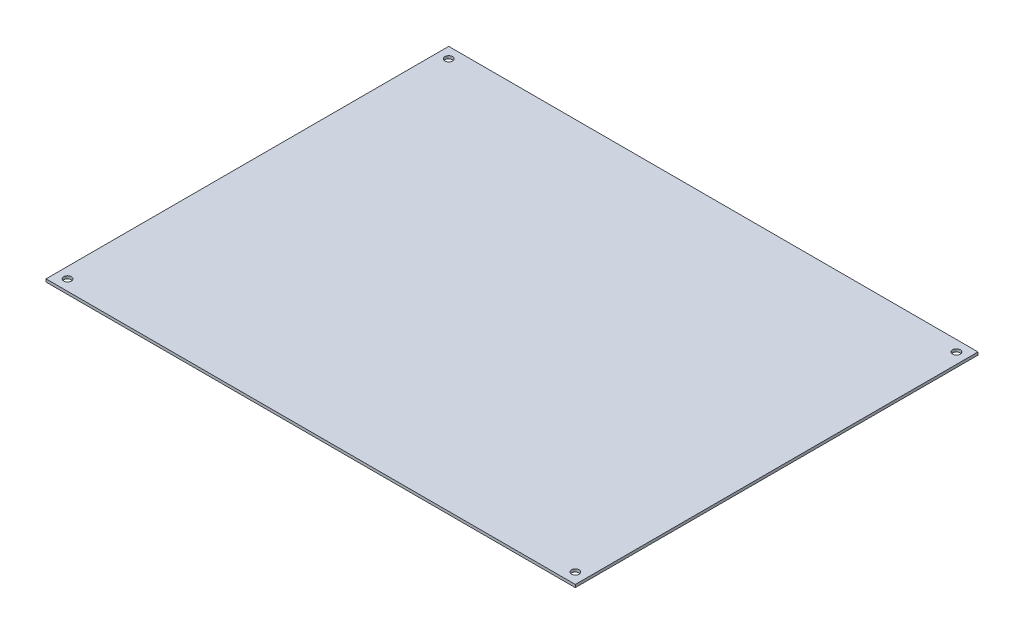
ISO-10303-21;
HEADER;
FILE_DESCRIPTION(('STEP AP214'),'2;1');
FILE_NAME('part.step','',(''),(''),'','','');
FILE_SCHEMA(('AUTOMOTIVE_DESIGN { 1 0 10303 214 1 1 1 1 }'));
ENDSEC;
DATA;
#1=APPLICATION_CONTEXT('core data for automotive mechanical design processes');
#2=APPLICATION_PROTOCOL_DEFINITION('international standard','automotive_design',2000,#1);
#3=PRODUCT_CONTEXT('',#1,'mechanical');
#4=PRODUCT('Part','Part','',(#3));
#5=PRODUCT_RELATED_PRODUCT_CATEGORY('part','',(#4));
#6=PRODUCT_DEFINITION_FORMATION('','',#4);
#7=PRODUCT_DEFINITION_CONTEXT('part definition',#1,'design');
#8=PRODUCT_DEFINITION('design','',#6,#7);
#9=PRODUCT_DEFINITION_SHAPE('','',#8);
#10=(LENGTH_UNIT() NAMED_UNIT(*) SI_UNIT(.MILLI.,.METRE.));
#11=(NAMED_UNIT(*) PLANE_ANGLE_UNIT() SI_UNIT($,.RADIAN.));
#12=(NAMED_UNIT(*) SI_UNIT($,.STERADIAN.) SOLID_ANGLE_UNIT());
#13=UNCERTAINTY_MEASURE_WITH_UNIT(LENGTH_MEASURE(1.E-05),#10,'distance_accuracy_value','');
#14=(GEOMETRIC_REPRESENTATION_CONTEXT(3) GLOBAL_UNCERTAINTY_ASSIGNED_CONTEXT((#13)) GLOBAL_UNIT_ASSIGNED_CONTEXT((#10,
#11,#12)) REPRESENTATION_CONTEXT('',''));
#15=CARTESIAN_POINT('',(0.,0.,0.));
#16=DIRECTION('',(0.,0.,1.));
#17=DIRECTION('',(1.,0.,0.));
#18=AXIS2_PLACEMENT_3D('',#15,#16,#17);
#19=CARTESIAN_POINT('',(-190.25,2.,-144.75));
#20=DIRECTION('',(1.,0.,0.));
#21=DIRECTION('',(0.,0.,-1.));
#22=AXIS2_PLACEMENT_3D('',#19,#20,#21);
#23=PLANE('',#22);
#24=DIRECTION('',(0.,0.,1.));
#25=VECTOR('',#24,1.);
#26=CARTESIAN_POINT('',(-190.25,0.,-144.75));
#27=LINE('',#26,#25);
#28=CARTESIAN_POINT('',(-190.25,0.,-144.75));
#29=VERTEX_POINT('',#28);
#30=CARTESIAN_POINT('',(-190.25,0.,144.75));
#31=VERTEX_POINT('',#30);
#32=EDGE_CURVE('E107',#29,#31,#27,.T.);
#33=ORIENTED_EDGE('',*,*,#32,.T.);
#34=DIRECTION('',(0.,-1.,0.));
#35=VECTOR('',#34,1.);
#36=CARTESIAN_POINT('',(-190.25,2.,144.75));
#37=LINE('',#36,#35);
#38=CARTESIAN_POINT('',(-190.25,2.,144.75));
#39=VERTEX_POINT('',#38);
#40=EDGE_CURVE('E11',#39,#31,#37,.T.);
#41=ORIENTED_EDGE('',*,*,#40,.F.);
#42=DIRECTION('',(0.,0.,1.));
#43=VECTOR('',#42,1.);
#44=CARTESIAN_POINT('',(-190.25,2.,-144.75));
#45=LINE('',#44,#43);
#46=CARTESIAN_POINT('',(-190.25,2.,-144.75));
#47=VERTEX_POINT('',#46);
#48=EDGE_CURVE('E91',#47,#39,#45,.T.);
#49=ORIENTED_EDGE('',*,*,#48,.F.);
#50=DIRECTION('',(0.,-1.,0.));
#51=VECTOR('',#50,1.);
#52=CARTESIAN_POINT('',(-190.25,2.,-144.75));
#53=LINE('',#52,#51);
#54=EDGE_CURVE('E103',#47,#29,#53,.T.);
#55=ORIENTED_EDGE('',*,*,#54,.T.);
#56=EDGE_LOOP('',(#33,#41,#49,#55));
#57=FACE_BOUND('',#56,.T.);
#58=ADVANCED_FACE('F39',(#57),#23,.F.);
#59=CARTESIAN_POINT('',(-190.25,2.,144.75));
#60=DIRECTION('',(0.,0.,-1.));
#61=DIRECTION('',(-1.,0.,0.));
#62=AXIS2_PLACEMENT_3D('',#59,#60,#61);
#63=PLANE('',#62);
#64=DIRECTION('',(1.,0.,0.));
#65=VECTOR('',#64,1.);
#66=CARTESIAN_POINT('',(-190.25,0.,144.75));
#67=LINE('',#66,#65);
#68=CARTESIAN_POINT('',(190.25,0.,144.75));
#69=VERTEX_POINT('',#68);
#70=EDGE_CURVE('E96',#31,#69,#67,.T.);
#71=ORIENTED_EDGE('',*,*,#70,.T.);
#72=DIRECTION('',(0.,-1.,0.));
#73=VECTOR('',#72,1.);
#74=CARTESIAN_POINT('',(190.25,2.,144.75));
#75=LINE('',#74,#73);
#76=CARTESIAN_POINT('',(190.25,2.,144.75));
#77=VERTEX_POINT('',#76);
#78=EDGE_CURVE('E48',#77,#69,#75,.T.);
#79=ORIENTED_EDGE('',*,*,#78,.F.);
#80=DIRECTION('',(1.,0.,0.));
#81=VECTOR('',#80,1.);
#82=CARTESIAN_POINT('',(-190.25,2.,144.75));
#83=LINE('',#82,#81);
#84=EDGE_CURVE('E86',#39,#77,#83,.T.);
#85=ORIENTED_EDGE('',*,*,#84,.F.);
#86=ORIENTED_EDGE('',*,*,#40,.T.);
#87=EDGE_LOOP('',(#71,#79,#85,#86));
#88=FACE_BOUND('',#87,.T.);
#89=ADVANCED_FACE('F95',(#88),#63,.F.);
#90=CARTESIAN_POINT('',(190.25,2.,-144.75));
#91=DIRECTION('',(-1.,0.,0.));
#92=DIRECTION('',(0.,0.,1.));
#93=AXIS2_PLACEMENT_3D('',#90,#91,#92);
#94=PLANE('',#93);
#95=DIRECTION('',(0.,0.,-1.));
#96=VECTOR('',#95,1.);
#97=CARTESIAN_POINT('',(190.25,0.,-144.75));
#98=LINE('',#97,#96);
#99=CARTESIAN_POINT('',(190.25,0.,-144.75));
#100=VERTEX_POINT('',#99);
#101=EDGE_CURVE('E73',#69,#100,#98,.T.);
#102=ORIENTED_EDGE('',*,*,#101,.T.);
#103=DIRECTION('',(0.,-1.,0.));
#104=VECTOR('',#103,1.);
#105=CARTESIAN_POINT('',(190.25,2.,-144.75));
#106=LINE('',#105,#104);
#107=CARTESIAN_POINT('',(190.25,2.,-144.75));
#108=VERTEX_POINT('',#107);
#109=EDGE_CURVE('E98',#108,#100,#106,.T.);
#110=ORIENTED_EDGE('',*,*,#109,.F.);
#111=DIRECTION('',(0.,0.,-1.));
#112=VECTOR('',#111,1.);
#113=CARTESIAN_POINT('',(190.25,2.,-144.75));
#114=LINE('',#113,#112);
#115=EDGE_CURVE('E89',#77,#108,#114,.T.);
#116=ORIENTED_EDGE('',*,*,#115,.F.);
#117=ORIENTED_EDGE('',*,*,#78,.T.);
#118=EDGE_LOOP('',(#102,#110,#116,#117));
#119=FACE_BOUND('',#118,.T.);
#120=ADVANCED_FACE('F99',(#119),#94,.F.);
#121=CARTESIAN_POINT('',(-190.25,2.,-144.75));
#122=DIRECTION('',(0.,0.,1.));
#123=DIRECTION('',(1.,0.,0.));
#124=AXIS2_PLACEMENT_3D('',#121,#122,#123);
#125=PLANE('',#124);
#126=DIRECTION('',(-1.,0.,0.));
#127=VECTOR('',#126,1.);
#128=CARTESIAN_POINT('',(-190.25,0.,-144.75));
#129=LINE('',#128,#127);
#130=EDGE_CURVE('E79',#100,#29,#129,.T.);
#131=ORIENTED_EDGE('',*,*,#130,.T.);
#132=ORIENTED_EDGE('',*,*,#54,.F.);
#133=DIRECTION('',(-1.,0.,0.));
#134=VECTOR('',#133,1.);
#135=CARTESIAN_POINT('',(-190.25,2.,-144.75));
#136=LINE('',#135,#134);
#137=EDGE_CURVE('E56',#108,#47,#136,.T.);
#138=ORIENTED_EDGE('',*,*,#137,.F.);
#139=ORIENTED_EDGE('',*,*,#109,.T.);
#140=EDGE_LOOP('',(#131,#132,#138,#139));
#141=FACE_BOUND('',#140,.T.);
#142=ADVANCED_FACE('F121',(#141),#125,.F.);
#143=CARTESIAN_POINT('',(0.,2.,0.));
#144=DIRECTION('',(0.,1.,0.));
#145=DIRECTION('',(0.,0.,1.));
#146=AXIS2_PLACEMENT_3D('',#143,#144,#145);
#147=PLANE('',#146);
#148=CARTESIAN_POINT('',(-182.5,2.,137.));
#149=DIRECTION('',(0.,1.,0.));
#150=DIRECTION('',(0.,0.,-1.));
#151=AXIS2_PLACEMENT_3D('',#148,#149,#150);
#152=CIRCLE('',#151,2.75000000000001);
#153=CARTESIAN_POINT('',(-182.5,2.,134.25));
#154=VERTEX_POINT('',#153);
#155=EDGE_CURVE('E152',#154,#154,#152,.T.);
#156=ORIENTED_EDGE('',*,*,#155,.F.);
#157=EDGE_LOOP('',(#156));
#158=FACE_BOUND('',#157,.T.);
#159=CARTESIAN_POINT('',(182.5,2.,137.));
#160=DIRECTION('',(0.,-1.,0.));
#161=DIRECTION('',(0.,0.,-1.));
#162=AXIS2_PLACEMENT_3D('',#159,#160,#161);
#163=CIRCLE('',#162,2.75000000000001);
#164=CARTESIAN_POINT('',(182.5,2.,134.25));
#165=VERTEX_POINT('',#164);
#166=EDGE_CURVE('E144',#165,#165,#163,.T.);
#167=ORIENTED_EDGE('',*,*,#166,.T.);
#168=EDGE_LOOP('',(#167));
#169=FACE_BOUND('',#168,.T.);
#170=CARTESIAN_POINT('',(-182.5,2.,-137.));
#171=DIRECTION('',(0.,-1.,0.));
#172=DIRECTION('',(0.,0.,1.));
#173=AXIS2_PLACEMENT_3D('',#170,#171,#172);
#174=CIRCLE('',#173,2.75000000000001);
#175=CARTESIAN_POINT('',(-182.5,2.,-134.25));
#176=VERTEX_POINT('',#175);
#177=EDGE_CURVE('E136',#176,#176,#174,.T.);
#178=ORIENTED_EDGE('',*,*,#177,.T.);
#179=EDGE_LOOP('',(#178));
#180=FACE_BOUND('',#179,.T.);
#181=CARTESIAN_POINT('',(182.5,2.,-137.));
#182=DIRECTION('',(0.,1.,0.));
#183=DIRECTION('',(0.,0.,1.));
#184=AXIS2_PLACEMENT_3D('',#181,#182,#183);
#185=CIRCLE('',#184,2.75000000000001);
#186=CARTESIAN_POINT('',(182.5,2.,-134.25));
#187=VERTEX_POINT('',#186);
#188=EDGE_CURVE('E128',#187,#187,#185,.T.);
#189=ORIENTED_EDGE('',*,*,#188,.F.);
#190=EDGE_LOOP('',(#189));
#191=FACE_BOUND('',#190,.T.);
#192=ORIENTED_EDGE('',*,*,#48,.T.);
#193=ORIENTED_EDGE('',*,*,#84,.T.);
#194=ORIENTED_EDGE('',*,*,#115,.T.);
#195=ORIENTED_EDGE('',*,*,#137,.T.);
#196=EDGE_LOOP('',(#192,#193,#194,#195));
#197=FACE_BOUND('',#196,.T.);
#198=ADVANCED_FACE('F87',(#158,#169,#180,#191,#197),#147,.T.);
#199=CARTESIAN_POINT('',(0.,0.,0.));
#200=DIRECTION('',(0.,1.,0.));
#201=DIRECTION('',(0.,0.,1.));
#202=AXIS2_PLACEMENT_3D('',#199,#200,#201);
#203=PLANE('',#202);
#204=CARTESIAN_POINT('',(-182.5,0.,137.));
#205=DIRECTION('',(0.,1.,0.));
#206=DIRECTION('',(0.,0.,-1.));
#207=AXIS2_PLACEMENT_3D('',#204,#205,#206);
#208=CIRCLE('',#207,2.75000000000001);
#209=CARTESIAN_POINT('',(-182.5,0.,134.25));
#210=VERTEX_POINT('',#209);
#211=EDGE_CURVE('E148',#210,#210,#208,.T.);
#212=ORIENTED_EDGE('',*,*,#211,.T.);
#213=EDGE_LOOP('',(#212));
#214=FACE_BOUND('',#213,.T.);
#215=CARTESIAN_POINT('',(182.5,0.,137.));
#216=DIRECTION('',(0.,-1.,0.));
#217=DIRECTION('',(0.,0.,-1.));
#218=AXIS2_PLACEMENT_3D('',#215,#216,#217);
#219=CIRCLE('',#218,2.75000000000001);
#220=CARTESIAN_POINT('',(182.5,0.,134.25));
#221=VERTEX_POINT('',#220);
#222=EDGE_CURVE('E140',#221,#221,#219,.T.);
#223=ORIENTED_EDGE('',*,*,#222,.F.);
#224=EDGE_LOOP('',(#223));
#225=FACE_BOUND('',#224,.T.);
#226=CARTESIAN_POINT('',(-182.5,0.,-137.));
#227=DIRECTION('',(0.,-1.,0.));
#228=DIRECTION('',(0.,0.,1.));
#229=AXIS2_PLACEMENT_3D('',#226,#227,#228);
#230=CIRCLE('',#229,2.75000000000001);
#231=CARTESIAN_POINT('',(-182.5,0.,-134.25));
#232=VERTEX_POINT('',#231);
#233=EDGE_CURVE('E132',#232,#232,#230,.T.);
#234=ORIENTED_EDGE('',*,*,#233,.F.);
#235=EDGE_LOOP('',(#234));
#236=FACE_BOUND('',#235,.T.);
#237=CARTESIAN_POINT('',(182.5,0.,-137.));
#238=DIRECTION('',(0.,1.,0.));
#239=DIRECTION('',(0.,0.,1.));
#240=AXIS2_PLACEMENT_3D('',#237,#238,#239);
#241=CIRCLE('',#240,2.75000000000001);
#242=CARTESIAN_POINT('',(182.5,0.,-134.25));
#243=VERTEX_POINT('',#242);
#244=EDGE_CURVE('E111',#243,#243,#241,.T.);
#245=ORIENTED_EDGE('',*,*,#244,.T.);
#246=EDGE_LOOP('',(#245));
#247=FACE_BOUND('',#246,.T.);
#248=ORIENTED_EDGE('',*,*,#32,.F.);
#249=ORIENTED_EDGE('',*,*,#130,.F.);
#250=ORIENTED_EDGE('',*,*,#101,.F.);
#251=ORIENTED_EDGE('',*,*,#70,.F.);
#252=EDGE_LOOP('',(#248,#249,#250,#251));
#253=FACE_BOUND('',#252,.T.);
#254=ADVANCED_FACE('F124',(#214,#225,#236,#247,#253),#203,.F.);
#255=CARTESIAN_POINT('',(182.5,0.,-137.));
#256=DIRECTION('',(0.,1.,0.));
#257=DIRECTION('',(0.,0.,1.));
#258=AXIS2_PLACEMENT_3D('',#255,#256,#257);
#259=CYLINDRICAL_SURFACE('',#258,2.75000000000001);
#260=ORIENTED_EDGE('',*,*,#244,.F.);
#261=EDGE_LOOP('',(#260));
#262=FACE_BOUND('',#261,.T.);
#263=ORIENTED_EDGE('',*,*,#188,.T.);
#264=EDGE_LOOP('',(#263));
#265=FACE_BOUND('',#264,.T.);
#266=ADVANCED_FACE('F178',(#262,#265),#259,.F.);
#267=CARTESIAN_POINT('',(-182.5,0.,-137.));
#268=DIRECTION('',(0.,1.,0.));
#269=DIRECTION('',(0.,0.,1.));
#270=AXIS2_PLACEMENT_3D('',#267,#268,#269);
#271=CYLINDRICAL_SURFACE('',#270,2.75000000000001);
#272=ORIENTED_EDGE('',*,*,#233,.T.);
#273=EDGE_LOOP('',(#272));
#274=FACE_BOUND('',#273,.T.);
#275=ORIENTED_EDGE('',*,*,#177,.F.);
#276=EDGE_LOOP('',(#275));
#277=FACE_BOUND('',#276,.T.);
#278=ADVANCED_FACE('F180',(#274,#277),#271,.F.);
#279=CARTESIAN_POINT('',(182.5,0.,137.));
#280=DIRECTION('',(0.,1.,0.));
#281=DIRECTION('',(0.,0.,1.));
#282=AXIS2_PLACEMENT_3D('',#279,#280,#281);
#283=CYLINDRICAL_SURFACE('',#282,2.75000000000001);
#284=ORIENTED_EDGE('',*,*,#222,.T.);
#285=EDGE_LOOP('',(#284));
#286=FACE_BOUND('',#285,.T.);
#287=ORIENTED_EDGE('',*,*,#166,.F.);
#288=EDGE_LOOP('',(#287));
#289=FACE_BOUND('',#288,.T.);
#290=ADVANCED_FACE('F165',(#286,#289),#283,.F.);
#291=CARTESIAN_POINT('',(-182.5,0.,137.));
#292=DIRECTION('',(0.,1.,0.));
#293=DIRECTION('',(0.,0.,1.));
#294=AXIS2_PLACEMENT_3D('',#291,#292,#293);
#295=CYLINDRICAL_SURFACE('',#294,2.75000000000001);
#296=ORIENTED_EDGE('',*,*,#211,.F.);
#297=EDGE_LOOP('',(#296));
#298=FACE_BOUND('',#297,.T.);
#299=ORIENTED_EDGE('',*,*,#155,.T.);
#300=EDGE_LOOP('',(#299));
#301=FACE_BOUND('',#300,.T.);
#302=ADVANCED_FACE('F162',(#298,#301),#295,.F.);
#303=CLOSED_SHELL('',(#58,#89,#120,#142,#198,#254,#266,#278,#290,#302));
#304=MANIFOLD_SOLID_BREP('B2',#303);
#305=ADVANCED_BREP_SHAPE_REPRESENTATION('',(#18,#304),#14);
#306=SHAPE_DEFINITION_REPRESENTATION(#9,#305);
ENDSEC;
END-ISO-10303-21;
